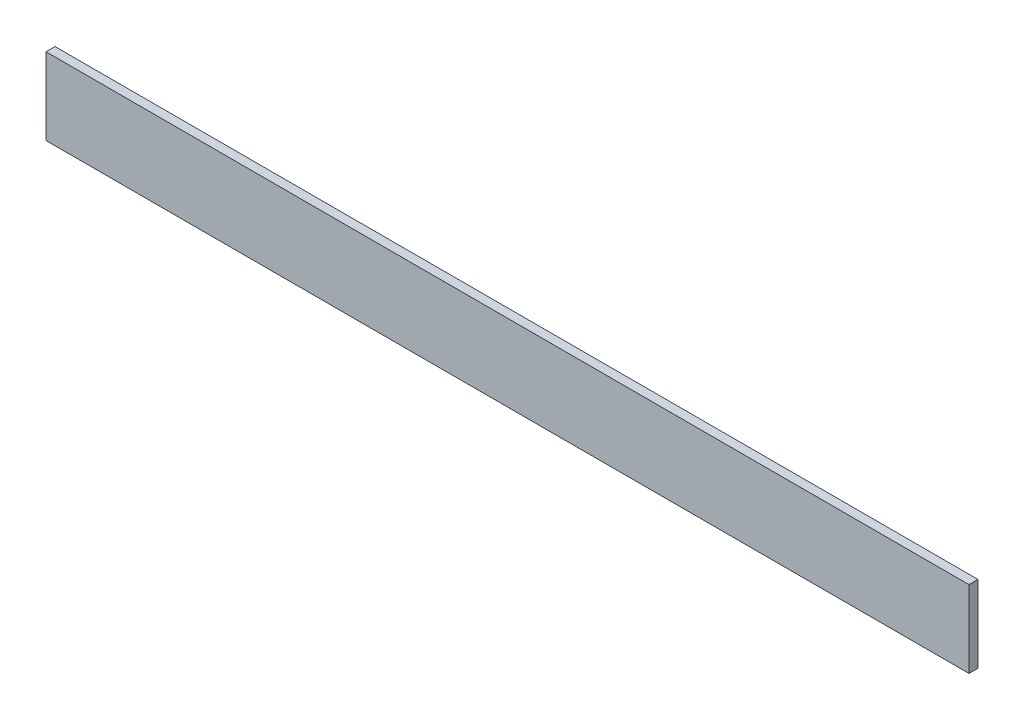
ISO-10303-21;
HEADER;
FILE_DESCRIPTION(('STEP AP214'),'2;1');
FILE_NAME('part.step','',(''),(''),'','','');
FILE_SCHEMA(('AUTOMOTIVE_DESIGN { 1 0 10303 214 1 1 1 1 }'));
ENDSEC;
DATA;
#1=APPLICATION_CONTEXT('core data for automotive mechanical design processes');
#2=APPLICATION_PROTOCOL_DEFINITION('international standard','automotive_design',2000,#1);
#3=PRODUCT_CONTEXT('',#1,'mechanical');
#4=PRODUCT('Part','Part','',(#3));
#5=PRODUCT_RELATED_PRODUCT_CATEGORY('part','',(#4));
#6=PRODUCT_DEFINITION_FORMATION('','',#4);
#7=PRODUCT_DEFINITION_CONTEXT('part definition',#1,'design');
#8=PRODUCT_DEFINITION('design','',#6,#7);
#9=PRODUCT_DEFINITION_SHAPE('','',#8);
#10=(LENGTH_UNIT() NAMED_UNIT(*) SI_UNIT(.MILLI.,.METRE.));
#11=(NAMED_UNIT(*) PLANE_ANGLE_UNIT() SI_UNIT($,.RADIAN.));
#12=(NAMED_UNIT(*) SI_UNIT($,.STERADIAN.) SOLID_ANGLE_UNIT());
#13=UNCERTAINTY_MEASURE_WITH_UNIT(LENGTH_MEASURE(1.E-05),#10,'distance_accuracy_value','');
#14=(GEOMETRIC_REPRESENTATION_CONTEXT(3) GLOBAL_UNCERTAINTY_ASSIGNED_CONTEXT((#13)) GLOBAL_UNIT_ASSIGNED_CONTEXT((#10,
#11,#12)) REPRESENTATION_CONTEXT('',''));
#15=CARTESIAN_POINT('',(0.,0.,0.));
#16=DIRECTION('',(0.,0.,1.));
#17=DIRECTION('',(1.,0.,0.));
#18=AXIS2_PLACEMENT_3D('',#15,#16,#17);
#19=CARTESIAN_POINT('',(609.6,-50.8,11.90625));
#20=DIRECTION('',(-1.,0.,0.));
#21=DIRECTION('',(0.,0.,1.));
#22=AXIS2_PLACEMENT_3D('',#19,#20,#21);
#23=PLANE('',#22);
#24=DIRECTION('',(0.,1.,0.));
#25=VECTOR('',#24,1.);
#26=CARTESIAN_POINT('',(609.6,-50.8,0.));
#27=LINE('',#26,#25);
#28=CARTESIAN_POINT('',(609.6,-50.8,0.));
#29=VERTEX_POINT('',#28);
#30=CARTESIAN_POINT('',(609.6,50.8,0.));
#31=VERTEX_POINT('',#30);
#32=EDGE_CURVE('E96',#29,#31,#27,.T.);
#33=ORIENTED_EDGE('',*,*,#32,.T.);
#34=DIRECTION('',(0.,0.,-1.));
#35=VECTOR('',#34,1.);
#36=CARTESIAN_POINT('',(609.6,50.8,11.90625));
#37=LINE('',#36,#35);
#38=CARTESIAN_POINT('',(609.6,50.8,11.90625));
#39=VERTEX_POINT('',#38);
#40=EDGE_CURVE('E11',#39,#31,#37,.T.);
#41=ORIENTED_EDGE('',*,*,#40,.F.);
#42=DIRECTION('',(0.,1.,0.));
#43=VECTOR('',#42,1.);
#44=CARTESIAN_POINT('',(609.6,-50.8,11.90625));
#45=LINE('',#44,#43);
#46=CARTESIAN_POINT('',(609.6,-50.8,11.90625));
#47=VERTEX_POINT('',#46);
#48=EDGE_CURVE('E84',#47,#39,#45,.T.);
#49=ORIENTED_EDGE('',*,*,#48,.F.);
#50=DIRECTION('',(0.,0.,-1.));
#51=VECTOR('',#50,1.);
#52=CARTESIAN_POINT('',(609.6,-50.8,11.90625));
#53=LINE('',#52,#51);
#54=EDGE_CURVE('E92',#47,#29,#53,.T.);
#55=ORIENTED_EDGE('',*,*,#54,.T.);
#56=EDGE_LOOP('',(#33,#41,#49,#55));
#57=FACE_BOUND('',#56,.T.);
#58=ADVANCED_FACE('F33',(#57),#23,.F.);
#59=CARTESIAN_POINT('',(-609.6,50.8,11.90625));
#60=DIRECTION('',(0.,-1.,0.));
#61=DIRECTION('',(0.,0.,-1.));
#62=AXIS2_PLACEMENT_3D('',#59,#60,#61);
#63=PLANE('',#62);
#64=DIRECTION('',(-1.,0.,0.));
#65=VECTOR('',#64,1.);
#66=CARTESIAN_POINT('',(-609.6,50.8,0.));
#67=LINE('',#66,#65);
#68=CARTESIAN_POINT('',(-609.6,50.8,0.));
#69=VERTEX_POINT('',#68);
#70=EDGE_CURVE('E88',#31,#69,#67,.T.);
#71=ORIENTED_EDGE('',*,*,#70,.T.);
#72=DIRECTION('',(0.,0.,-1.));
#73=VECTOR('',#72,1.);
#74=CARTESIAN_POINT('',(-609.6,50.8,11.90625));
#75=LINE('',#74,#73);
#76=CARTESIAN_POINT('',(-609.6,50.8,11.90625));
#77=VERTEX_POINT('',#76);
#78=EDGE_CURVE('E41',#77,#69,#75,.T.);
#79=ORIENTED_EDGE('',*,*,#78,.F.);
#80=DIRECTION('',(-1.,0.,0.));
#81=VECTOR('',#80,1.);
#82=CARTESIAN_POINT('',(-609.6,50.8,11.90625));
#83=LINE('',#82,#81);
#84=EDGE_CURVE('E79',#39,#77,#83,.T.);
#85=ORIENTED_EDGE('',*,*,#84,.F.);
#86=ORIENTED_EDGE('',*,*,#40,.T.);
#87=EDGE_LOOP('',(#71,#79,#85,#86));
#88=FACE_BOUND('',#87,.T.);
#89=ADVANCED_FACE('F87',(#88),#63,.F.);
#90=CARTESIAN_POINT('',(-609.6,-50.8,11.90625));
#91=DIRECTION('',(1.,0.,0.));
#92=DIRECTION('',(0.,0.,-1.));
#93=AXIS2_PLACEMENT_3D('',#90,#91,#92);
#94=PLANE('',#93);
#95=DIRECTION('',(0.,-1.,0.));
#96=VECTOR('',#95,1.);
#97=CARTESIAN_POINT('',(-609.6,-50.8,0.));
#98=LINE('',#97,#96);
#99=CARTESIAN_POINT('',(-609.6,-50.8,0.));
#100=VERTEX_POINT('',#99);
#101=EDGE_CURVE('E66',#69,#100,#98,.T.);
#102=ORIENTED_EDGE('',*,*,#101,.T.);
#103=DIRECTION('',(0.,0.,-1.));
#104=VECTOR('',#103,1.);
#105=CARTESIAN_POINT('',(-609.6,-50.8,11.90625));
#106=LINE('',#105,#104);
#107=CARTESIAN_POINT('',(-609.6,-50.8,11.90625));
#108=VERTEX_POINT('',#107);
#109=EDGE_CURVE('E89',#108,#100,#106,.T.);
#110=ORIENTED_EDGE('',*,*,#109,.F.);
#111=DIRECTION('',(0.,-1.,0.));
#112=VECTOR('',#111,1.);
#113=CARTESIAN_POINT('',(-609.6,-50.8,11.90625));
#114=LINE('',#113,#112);
#115=EDGE_CURVE('E82',#77,#108,#114,.T.);
#116=ORIENTED_EDGE('',*,*,#115,.F.);
#117=ORIENTED_EDGE('',*,*,#78,.T.);
#118=EDGE_LOOP('',(#102,#110,#116,#117));
#119=FACE_BOUND('',#118,.T.);
#120=ADVANCED_FACE('F90',(#119),#94,.F.);
#121=CARTESIAN_POINT('',(-609.6,-50.8,11.90625));
#122=DIRECTION('',(0.,1.,0.));
#123=DIRECTION('',(0.,0.,1.));
#124=AXIS2_PLACEMENT_3D('',#121,#122,#123);
#125=PLANE('',#124);
#126=DIRECTION('',(1.,0.,0.));
#127=VECTOR('',#126,1.);
#128=CARTESIAN_POINT('',(-609.6,-50.8,0.));
#129=LINE('',#128,#127);
#130=EDGE_CURVE('E72',#100,#29,#129,.T.);
#131=ORIENTED_EDGE('',*,*,#130,.T.);
#132=ORIENTED_EDGE('',*,*,#54,.F.);
#133=DIRECTION('',(1.,0.,0.));
#134=VECTOR('',#133,1.);
#135=CARTESIAN_POINT('',(-609.6,-50.8,11.90625));
#136=LINE('',#135,#134);
#137=EDGE_CURVE('E49',#108,#47,#136,.T.);
#138=ORIENTED_EDGE('',*,*,#137,.F.);
#139=ORIENTED_EDGE('',*,*,#109,.T.);
#140=EDGE_LOOP('',(#131,#132,#138,#139));
#141=FACE_BOUND('',#140,.T.);
#142=ADVANCED_FACE('F103',(#141),#125,.F.);
#143=CARTESIAN_POINT('',(0.,0.,11.90625));
#144=DIRECTION('',(0.,0.,-1.));
#145=DIRECTION('',(-1.,0.,0.));
#146=AXIS2_PLACEMENT_3D('',#143,#144,#145);
#147=PLANE('',#146);
#148=ORIENTED_EDGE('',*,*,#48,.T.);
#149=ORIENTED_EDGE('',*,*,#84,.T.);
#150=ORIENTED_EDGE('',*,*,#115,.T.);
#151=ORIENTED_EDGE('',*,*,#137,.T.);
#152=EDGE_LOOP('',(#148,#149,#150,#151));
#153=FACE_BOUND('',#152,.T.);
#154=ADVANCED_FACE('F80',(#153),#147,.F.);
#155=CARTESIAN_POINT('',(0.,0.,0.));
#156=DIRECTION('',(0.,0.,-1.));
#157=DIRECTION('',(-1.,0.,0.));
#158=AXIS2_PLACEMENT_3D('',#155,#156,#157);
#159=PLANE('',#158);
#160=ORIENTED_EDGE('',*,*,#32,.F.);
#161=ORIENTED_EDGE('',*,*,#130,.F.);
#162=ORIENTED_EDGE('',*,*,#101,.F.);
#163=ORIENTED_EDGE('',*,*,#70,.F.);
#164=EDGE_LOOP('',(#160,#161,#162,#163));
#165=FACE_BOUND('',#164,.T.);
#166=ADVANCED_FACE('F106',(#165),#159,.T.);
#167=CLOSED_SHELL('',(#58,#89,#120,#142,#154,#166));
#168=MANIFOLD_SOLID_BREP('B2',#167);
#169=ADVANCED_BREP_SHAPE_REPRESENTATION('',(#18,#168),#14);
#170=SHAPE_DEFINITION_REPRESENTATION(#9,#169);
ENDSEC;
END-ISO-10303-21;
